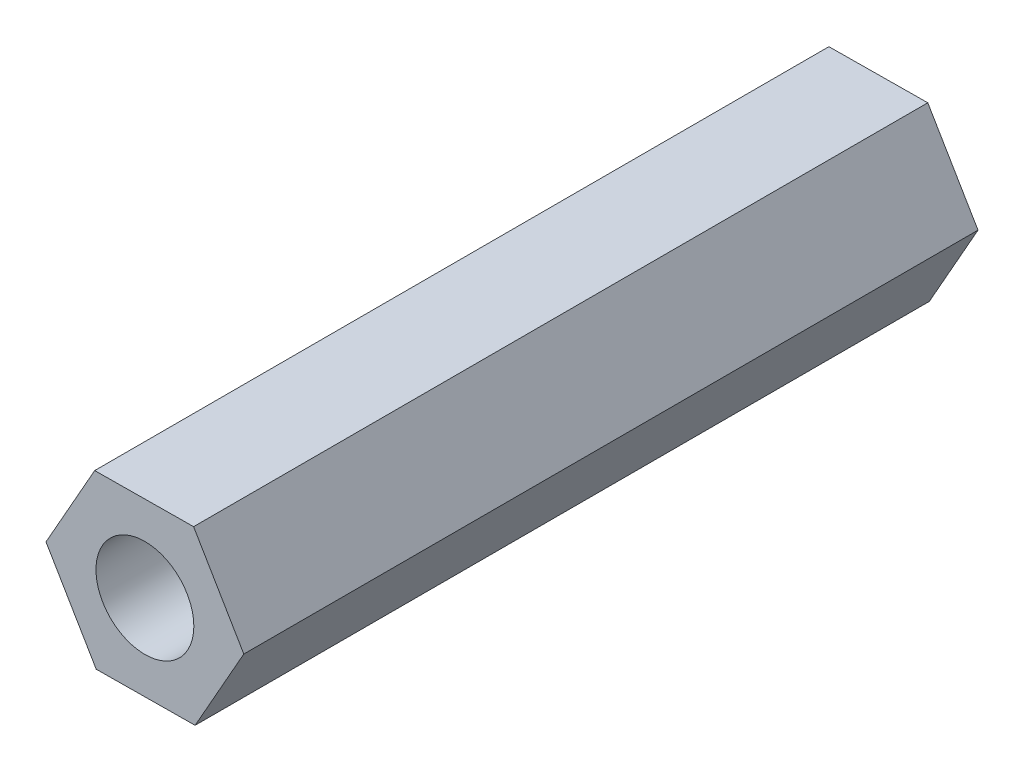
ISO-10303-21;
HEADER;
FILE_DESCRIPTION(('STEP AP214'),'2;1');
FILE_NAME('part.step','',(''),(''),'','','');
FILE_SCHEMA(('AUTOMOTIVE_DESIGN { 1 0 10303 214 1 1 1 1 }'));
ENDSEC;
DATA;
#1=APPLICATION_CONTEXT('core data for automotive mechanical design processes');
#2=APPLICATION_PROTOCOL_DEFINITION('international standard','automotive_design',2000,#1);
#3=PRODUCT_CONTEXT('',#1,'mechanical');
#4=PRODUCT('Part','Part','',(#3));
#5=PRODUCT_RELATED_PRODUCT_CATEGORY('part','',(#4));
#6=PRODUCT_DEFINITION_FORMATION('','',#4);
#7=PRODUCT_DEFINITION_CONTEXT('part definition',#1,'design');
#8=PRODUCT_DEFINITION('design','',#6,#7);
#9=PRODUCT_DEFINITION_SHAPE('','',#8);
#10=(LENGTH_UNIT() NAMED_UNIT(*) SI_UNIT(.MILLI.,.METRE.));
#11=(NAMED_UNIT(*) PLANE_ANGLE_UNIT() SI_UNIT($,.RADIAN.));
#12=(NAMED_UNIT(*) SI_UNIT($,.STERADIAN.) SOLID_ANGLE_UNIT());
#13=UNCERTAINTY_MEASURE_WITH_UNIT(LENGTH_MEASURE(1.E-05),#10,'distance_accuracy_value','');
#14=(GEOMETRIC_REPRESENTATION_CONTEXT(3) GLOBAL_UNCERTAINTY_ASSIGNED_CONTEXT((#13)) GLOBAL_UNIT_ASSIGNED_CONTEXT((#10,
#11,#12)) REPRESENTATION_CONTEXT('',''));
#15=CARTESIAN_POINT('',(0.,0.,0.));
#16=DIRECTION('',(0.,0.,1.));
#17=DIRECTION('',(1.,0.,0.));
#18=AXIS2_PLACEMENT_3D('',#15,#16,#17);
#19=CARTESIAN_POINT('',(0.,0.,30.));
#20=DIRECTION('',(0.,0.,1.));
#21=DIRECTION('',(1.,0.,0.));
#22=AXIS2_PLACEMENT_3D('',#19,#20,#21);
#23=PLANE('',#22);
#24=DIRECTION('',(0.999961257640527,0.00880245522430722,0.));
#25=VECTOR('',#24,1.);
#26=CARTESIAN_POINT('',(-1.98983906118775,-3.51765175136834,30.));
#27=LINE('',#26,#25);
#28=CARTESIAN_POINT('',(-1.98983906118775,-3.51765175136834,30.));
#29=VERTEX_POINT('',#28);
#30=CARTESIAN_POINT('',(2.05145624775792,-3.48207705211536,30.));
#31=VERTEX_POINT('',#30);
#32=EDGE_CURVE('E146',#29,#31,#27,.T.);
#33=ORIENTED_EDGE('',*,*,#32,.T.);
#34=DIRECTION('',(0.492357478980338,0.870393079529086,0.));
#35=VECTOR('',#34,1.);
#36=CARTESIAN_POINT('',(2.05145624775792,-3.48207705211536,30.));
#37=LINE('',#36,#35);
#38=CARTESIAN_POINT('',(4.04129530894568,0.0355746992529791,30.));
#39=VERTEX_POINT('',#38);
#40=EDGE_CURVE('E94',#31,#39,#37,.T.);
#41=ORIENTED_EDGE('',*,*,#40,.T.);
#42=DIRECTION('',(-0.507603778660189,0.861590624304779,0.));
#43=VECTOR('',#42,1.);
#44=CARTESIAN_POINT('',(4.04129530894568,0.0355746992529791,30.));
#45=LINE('',#44,#43);
#46=CARTESIAN_POINT('',(1.98983906118776,3.51765175136834,30.));
#47=VERTEX_POINT('',#46);
#48=EDGE_CURVE('E107',#39,#47,#45,.T.);
#49=ORIENTED_EDGE('',*,*,#48,.T.);
#50=DIRECTION('',(-0.999961257640527,-0.00880245522430723,0.));
#51=VECTOR('',#50,1.);
#52=CARTESIAN_POINT('',(1.98983906118776,3.51765175136834,30.));
#53=LINE('',#52,#51);
#54=CARTESIAN_POINT('',(-2.05145624775791,3.48207705211536,30.));
#55=VERTEX_POINT('',#54);
#56=EDGE_CURVE('E101',#47,#55,#53,.T.);
#57=ORIENTED_EDGE('',*,*,#56,.T.);
#58=DIRECTION('',(-0.492357478980338,-0.870393079529086,0.));
#59=VECTOR('',#58,1.);
#60=CARTESIAN_POINT('',(-2.05145624775791,3.48207705211536,30.));
#61=LINE('',#60,#59);
#62=CARTESIAN_POINT('',(-4.04129530894568,-0.0355746992529825,30.));
#63=VERTEX_POINT('',#62);
#64=EDGE_CURVE('E105',#55,#63,#61,.T.);
#65=ORIENTED_EDGE('',*,*,#64,.T.);
#66=DIRECTION('',(0.507603778660189,-0.861590624304779,0.));
#67=VECTOR('',#66,1.);
#68=CARTESIAN_POINT('',(-4.04129530894568,-0.0355746992529825,30.));
#69=LINE('',#68,#67);
#70=EDGE_CURVE('E57',#63,#29,#69,.T.);
#71=ORIENTED_EDGE('',*,*,#70,.T.);
#72=EDGE_LOOP('',(#33,#41,#49,#57,#65,#71));
#73=FACE_BOUND('',#72,.T.);
#74=CARTESIAN_POINT('',(0.,0.,30.));
#75=DIRECTION('',(0.,0.,1.));
#76=DIRECTION('',(1.,0.,0.));
#77=AXIS2_PLACEMENT_3D('',#74,#75,#76);
#78=CIRCLE('',#77,2.);
#79=CARTESIAN_POINT('',(2.,0.,30.));
#80=VERTEX_POINT('',#79);
#81=EDGE_CURVE('E134',#80,#80,#78,.T.);
#82=ORIENTED_EDGE('',*,*,#81,.F.);
#83=EDGE_LOOP('',(#82));
#84=FACE_BOUND('',#83,.T.);
#85=ADVANCED_FACE('F39',(#73,#84),#23,.T.);
#86=CARTESIAN_POINT('',(0.,0.,0.));
#87=DIRECTION('',(0.,0.,1.));
#88=DIRECTION('',(1.,0.,0.));
#89=AXIS2_PLACEMENT_3D('',#86,#87,#88);
#90=PLANE('',#89);
#91=DIRECTION('',(0.999961257640527,0.00880245522430722,0.));
#92=VECTOR('',#91,1.);
#93=CARTESIAN_POINT('',(-1.98983906118775,-3.51765175136834,0.));
#94=LINE('',#93,#92);
#95=CARTESIAN_POINT('',(-1.98983906118775,-3.51765175136834,0.));
#96=VERTEX_POINT('',#95);
#97=CARTESIAN_POINT('',(2.05145624775792,-3.48207705211536,0.));
#98=VERTEX_POINT('',#97);
#99=EDGE_CURVE('E129',#96,#98,#94,.T.);
#100=ORIENTED_EDGE('',*,*,#99,.F.);
#101=DIRECTION('',(0.507603778660189,-0.861590624304779,0.));
#102=VECTOR('',#101,1.);
#103=CARTESIAN_POINT('',(-4.04129530894568,-0.0355746992529825,0.));
#104=LINE('',#103,#102);
#105=CARTESIAN_POINT('',(-4.04129530894568,-0.0355746992529825,0.));
#106=VERTEX_POINT('',#105);
#107=EDGE_CURVE('E86',#106,#96,#104,.T.);
#108=ORIENTED_EDGE('',*,*,#107,.F.);
#109=DIRECTION('',(-0.492357478980338,-0.870393079529086,0.));
#110=VECTOR('',#109,1.);
#111=CARTESIAN_POINT('',(-2.05145624775791,3.48207705211536,0.));
#112=LINE('',#111,#110);
#113=CARTESIAN_POINT('',(-2.05145624775791,3.48207705211536,0.));
#114=VERTEX_POINT('',#113);
#115=EDGE_CURVE('E80',#114,#106,#112,.T.);
#116=ORIENTED_EDGE('',*,*,#115,.F.);
#117=DIRECTION('',(-0.999961257640527,-0.00880245522430723,0.));
#118=VECTOR('',#117,1.);
#119=CARTESIAN_POINT('',(1.98983906118776,3.51765175136834,0.));
#120=LINE('',#119,#118);
#121=CARTESIAN_POINT('',(1.98983906118776,3.51765175136834,0.));
#122=VERTEX_POINT('',#121);
#123=EDGE_CURVE('E116',#122,#114,#120,.T.);
#124=ORIENTED_EDGE('',*,*,#123,.F.);
#125=DIRECTION('',(-0.507603778660189,0.861590624304779,0.));
#126=VECTOR('',#125,1.);
#127=CARTESIAN_POINT('',(4.04129530894568,0.0355746992529791,0.));
#128=LINE('',#127,#126);
#129=CARTESIAN_POINT('',(4.04129530894568,0.0355746992529791,0.));
#130=VERTEX_POINT('',#129);
#131=EDGE_CURVE('E137',#130,#122,#128,.T.);
#132=ORIENTED_EDGE('',*,*,#131,.F.);
#133=DIRECTION('',(0.492357478980338,0.870393079529086,0.));
#134=VECTOR('',#133,1.);
#135=CARTESIAN_POINT('',(2.05145624775792,-3.48207705211536,0.));
#136=LINE('',#135,#134);
#137=EDGE_CURVE('E133',#98,#130,#136,.T.);
#138=ORIENTED_EDGE('',*,*,#137,.F.);
#139=EDGE_LOOP('',(#100,#108,#116,#124,#132,#138));
#140=FACE_BOUND('',#139,.T.);
#141=CARTESIAN_POINT('',(0.,0.,0.));
#142=DIRECTION('',(0.,0.,1.));
#143=DIRECTION('',(1.,0.,0.));
#144=AXIS2_PLACEMENT_3D('',#141,#142,#143);
#145=CIRCLE('',#144,2.);
#146=CARTESIAN_POINT('',(2.,0.,0.));
#147=VERTEX_POINT('',#146);
#148=EDGE_CURVE('E243',#147,#147,#145,.T.);
#149=ORIENTED_EDGE('',*,*,#148,.T.);
#150=EDGE_LOOP('',(#149));
#151=FACE_BOUND('',#150,.T.);
#152=ADVANCED_FACE('F159',(#140,#151),#90,.F.);
#153=CARTESIAN_POINT('',(-1.98983906118775,-3.51765175136834,30.));
#154=DIRECTION('',(-0.00880245522430722,0.999961257640527,0.));
#155=DIRECTION('',(-0.999961257640527,-0.00880245522430722,0.));
#156=AXIS2_PLACEMENT_3D('',#153,#154,#155);
#157=PLANE('',#156);
#158=ORIENTED_EDGE('',*,*,#99,.T.);
#159=DIRECTION('',(0.,0.,-1.));
#160=VECTOR('',#159,1.);
#161=CARTESIAN_POINT('',(2.05145624775792,-3.48207705211536,30.));
#162=LINE('',#161,#160);
#163=EDGE_CURVE('E11',#31,#98,#162,.T.);
#164=ORIENTED_EDGE('',*,*,#163,.F.);
#165=ORIENTED_EDGE('',*,*,#32,.F.);
#166=DIRECTION('',(0.,0.,-1.));
#167=VECTOR('',#166,1.);
#168=CARTESIAN_POINT('',(-1.98983906118775,-3.51765175136834,30.));
#169=LINE('',#168,#167);
#170=EDGE_CURVE('E125',#29,#96,#169,.T.);
#171=ORIENTED_EDGE('',*,*,#170,.T.);
#172=EDGE_LOOP('',(#158,#164,#165,#171));
#173=FACE_BOUND('',#172,.T.);
#174=ADVANCED_FACE('F41',(#173),#157,.F.);
#175=CARTESIAN_POINT('',(2.05145624775792,-3.48207705211536,30.));
#176=DIRECTION('',(-0.870393079529086,0.492357478980338,0.));
#177=DIRECTION('',(-0.492357478980338,-0.870393079529086,0.));
#178=AXIS2_PLACEMENT_3D('',#175,#176,#177);
#179=PLANE('',#178);
#180=ORIENTED_EDGE('',*,*,#137,.T.);
#181=DIRECTION('',(0.,0.,-1.));
#182=VECTOR('',#181,1.);
#183=CARTESIAN_POINT('',(4.04129530894568,0.0355746992529791,30.));
#184=LINE('',#183,#182);
#185=EDGE_CURVE('E49',#39,#130,#184,.T.);
#186=ORIENTED_EDGE('',*,*,#185,.F.);
#187=ORIENTED_EDGE('',*,*,#40,.F.);
#188=ORIENTED_EDGE('',*,*,#163,.T.);
#189=EDGE_LOOP('',(#180,#186,#187,#188));
#190=FACE_BOUND('',#189,.T.);
#191=ADVANCED_FACE('F184',(#190),#179,.F.);
#192=CARTESIAN_POINT('',(4.04129530894568,0.0355746992529791,30.));
#193=DIRECTION('',(-0.861590624304779,-0.507603778660189,0.));
#194=DIRECTION('',(0.507603778660189,-0.861590624304779,0.));
#195=AXIS2_PLACEMENT_3D('',#192,#193,#194);
#196=PLANE('',#195);
#197=ORIENTED_EDGE('',*,*,#131,.T.);
#198=DIRECTION('',(0.,0.,-1.));
#199=VECTOR('',#198,1.);
#200=CARTESIAN_POINT('',(1.98983906118776,3.51765175136834,30.));
#201=LINE('',#200,#199);
#202=EDGE_CURVE('E118',#47,#122,#201,.T.);
#203=ORIENTED_EDGE('',*,*,#202,.F.);
#204=ORIENTED_EDGE('',*,*,#48,.F.);
#205=ORIENTED_EDGE('',*,*,#185,.T.);
#206=EDGE_LOOP('',(#197,#203,#204,#205));
#207=FACE_BOUND('',#206,.T.);
#208=ADVANCED_FACE('F156',(#207),#196,.F.);
#209=CARTESIAN_POINT('',(1.98983906118776,3.51765175136834,30.));
#210=DIRECTION('',(0.00880245522430723,-0.999961257640527,0.));
#211=DIRECTION('',(0.999961257640527,0.00880245522430723,0.));
#212=AXIS2_PLACEMENT_3D('',#209,#210,#211);
#213=PLANE('',#212);
#214=ORIENTED_EDGE('',*,*,#123,.T.);
#215=DIRECTION('',(0.,0.,-1.));
#216=VECTOR('',#215,1.);
#217=CARTESIAN_POINT('',(-2.05145624775791,3.48207705211536,30.));
#218=LINE('',#217,#216);
#219=EDGE_CURVE('E113',#55,#114,#218,.T.);
#220=ORIENTED_EDGE('',*,*,#219,.F.);
#221=ORIENTED_EDGE('',*,*,#56,.F.);
#222=ORIENTED_EDGE('',*,*,#202,.T.);
#223=EDGE_LOOP('',(#214,#220,#221,#222));
#224=FACE_BOUND('',#223,.T.);
#225=ADVANCED_FACE('F114',(#224),#213,.F.);
#226=CARTESIAN_POINT('',(-2.05145624775791,3.48207705211536,30.));
#227=DIRECTION('',(0.870393079529086,-0.492357478980338,0.));
#228=DIRECTION('',(0.492357478980338,0.870393079529086,0.));
#229=AXIS2_PLACEMENT_3D('',#226,#227,#228);
#230=PLANE('',#229);
#231=ORIENTED_EDGE('',*,*,#115,.T.);
#232=DIRECTION('',(0.,0.,-1.));
#233=VECTOR('',#232,1.);
#234=CARTESIAN_POINT('',(-4.04129530894568,-0.0355746992529825,30.));
#235=LINE('',#234,#233);
#236=EDGE_CURVE('E119',#63,#106,#235,.T.);
#237=ORIENTED_EDGE('',*,*,#236,.F.);
#238=ORIENTED_EDGE('',*,*,#64,.F.);
#239=ORIENTED_EDGE('',*,*,#219,.T.);
#240=EDGE_LOOP('',(#231,#237,#238,#239));
#241=FACE_BOUND('',#240,.T.);
#242=ADVANCED_FACE('F121',(#241),#230,.F.);
#243=CARTESIAN_POINT('',(-4.04129530894568,-0.0355746992529825,30.));
#244=DIRECTION('',(0.861590624304779,0.507603778660189,0.));
#245=DIRECTION('',(-0.507603778660189,0.861590624304779,0.));
#246=AXIS2_PLACEMENT_3D('',#243,#244,#245);
#247=PLANE('',#246);
#248=ORIENTED_EDGE('',*,*,#107,.T.);
#249=ORIENTED_EDGE('',*,*,#170,.F.);
#250=ORIENTED_EDGE('',*,*,#70,.F.);
#251=ORIENTED_EDGE('',*,*,#236,.T.);
#252=EDGE_LOOP('',(#248,#249,#250,#251));
#253=FACE_BOUND('',#252,.T.);
#254=ADVANCED_FACE('F164',(#253),#247,.F.);
#255=CARTESIAN_POINT('',(0.,0.,30.));
#256=DIRECTION('',(0.,0.,-1.));
#257=DIRECTION('',(-1.,0.,0.));
#258=AXIS2_PLACEMENT_3D('',#255,#256,#257);
#259=CYLINDRICAL_SURFACE('',#258,2.);
#260=ORIENTED_EDGE('',*,*,#81,.T.);
#261=EDGE_LOOP('',(#260));
#262=FACE_BOUND('',#261,.T.);
#263=ORIENTED_EDGE('',*,*,#148,.F.);
#264=EDGE_LOOP('',(#263));
#265=FACE_BOUND('',#264,.T.);
#266=ADVANCED_FACE('F166',(#262,#265),#259,.F.);
#267=CLOSED_SHELL('',(#85,#152,#174,#191,#208,#225,#242,#254,#266));
#268=MANIFOLD_SOLID_BREP('B2',#267);
#269=ADVANCED_BREP_SHAPE_REPRESENTATION('',(#18,#268),#14);
#270=SHAPE_DEFINITION_REPRESENTATION(#9,#269);
ENDSEC;
END-ISO-10303-21;
